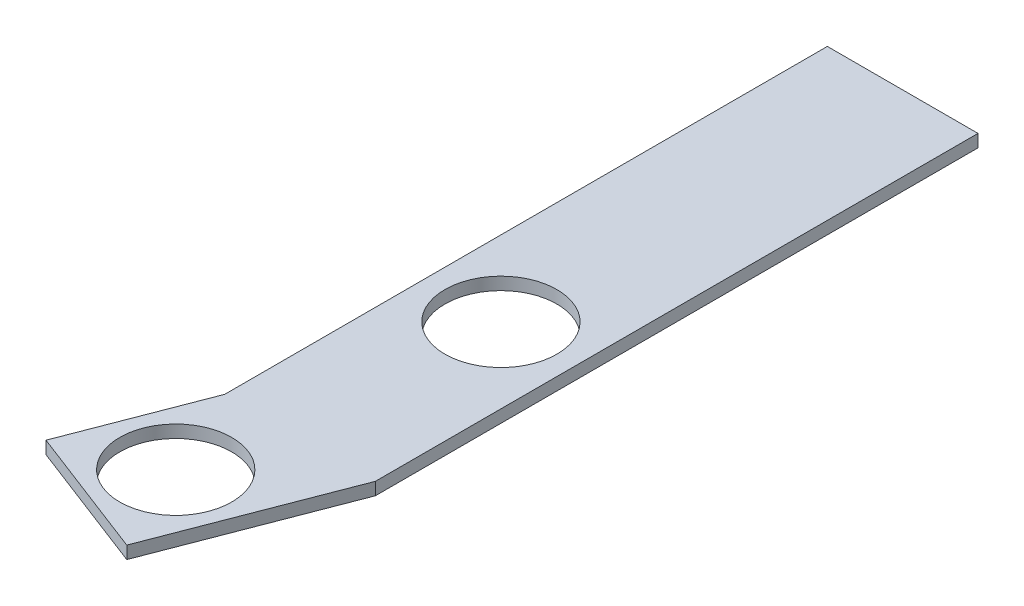
ISO-10303-21;
HEADER;
FILE_DESCRIPTION(('STEP AP214'),'2;1');
FILE_NAME('part.step','',(''),(''),'','','');
FILE_SCHEMA(('AUTOMOTIVE_DESIGN { 1 0 10303 214 1 1 1 1 }'));
ENDSEC;
DATA;
#1=APPLICATION_CONTEXT('core data for automotive mechanical design processes');
#2=APPLICATION_PROTOCOL_DEFINITION('international standard','automotive_design',2000,#1);
#3=PRODUCT_CONTEXT('',#1,'mechanical');
#4=PRODUCT('Part','Part','',(#3));
#5=PRODUCT_RELATED_PRODUCT_CATEGORY('part','',(#4));
#6=PRODUCT_DEFINITION_FORMATION('','',#4);
#7=PRODUCT_DEFINITION_CONTEXT('part definition',#1,'design');
#8=PRODUCT_DEFINITION('design','',#6,#7);
#9=PRODUCT_DEFINITION_SHAPE('','',#8);
#10=(LENGTH_UNIT() NAMED_UNIT(*) SI_UNIT(.MILLI.,.METRE.));
#11=(NAMED_UNIT(*) PLANE_ANGLE_UNIT() SI_UNIT($,.RADIAN.));
#12=(NAMED_UNIT(*) SI_UNIT($,.STERADIAN.) SOLID_ANGLE_UNIT());
#13=UNCERTAINTY_MEASURE_WITH_UNIT(LENGTH_MEASURE(1.E-05),#10,'distance_accuracy_value','');
#14=(GEOMETRIC_REPRESENTATION_CONTEXT(3) GLOBAL_UNCERTAINTY_ASSIGNED_CONTEXT((#13)) GLOBAL_UNIT_ASSIGNED_CONTEXT((#10,
#11,#12)) REPRESENTATION_CONTEXT('',''));
#15=CARTESIAN_POINT('',(0.,0.,0.));
#16=DIRECTION('',(0.,0.,1.));
#17=DIRECTION('',(1.,0.,0.));
#18=AXIS2_PLACEMENT_3D('',#15,#16,#17);
#19=CARTESIAN_POINT('',(1.58405379506825,3.175,121.606827019498));
#20=DIRECTION('',(-0.933333333333333,0.,-0.359010987142301));
#21=DIRECTION('',(-0.359010987142301,0.,0.933333333333333));
#22=AXIS2_PLACEMENT_3D('',#19,#20,#21);
#23=PLANE('',#22);
#24=DIRECTION('',(0.359010987142301,0.,-0.933333333333333));
#25=VECTOR('',#24,1.);
#26=CARTESIAN_POINT('',(1.58405379506825,0.,121.606827019498));
#27=LINE('',#26,#25);
#28=CARTESIAN_POINT('',(1.58405379506825,0.,121.606827019498));
#29=VERTEX_POINT('',#28);
#30=CARTESIAN_POINT('',(19.05,0.,76.2));
#31=VERTEX_POINT('',#30);
#32=EDGE_CURVE('E127',#29,#31,#27,.T.);
#33=ORIENTED_EDGE('',*,*,#32,.T.);
#34=DIRECTION('',(0.,-1.,0.));
#35=VECTOR('',#34,1.);
#36=CARTESIAN_POINT('',(19.05,3.175,76.2));
#37=LINE('',#36,#35);
#38=CARTESIAN_POINT('',(19.05,3.175,76.2));
#39=VERTEX_POINT('',#38);
#40=EDGE_CURVE('E11',#39,#31,#37,.T.);
#41=ORIENTED_EDGE('',*,*,#40,.F.);
#42=DIRECTION('',(0.359010987142301,0.,-0.933333333333333));
#43=VECTOR('',#42,1.);
#44=CARTESIAN_POINT('',(1.58405379506825,3.175,121.606827019498));
#45=LINE('',#44,#43);
#46=CARTESIAN_POINT('',(1.58405379506825,3.175,121.606827019498));
#47=VERTEX_POINT('',#46);
#48=EDGE_CURVE('E144',#47,#39,#45,.T.);
#49=ORIENTED_EDGE('',*,*,#48,.F.);
#50=DIRECTION('',(0.,-1.,0.));
#51=VECTOR('',#50,1.);
#52=CARTESIAN_POINT('',(1.58405379506825,3.175,121.606827019498));
#53=LINE('',#52,#51);
#54=EDGE_CURVE('E123',#47,#29,#53,.T.);
#55=ORIENTED_EDGE('',*,*,#54,.T.);
#56=EDGE_LOOP('',(#33,#41,#49,#55));
#57=FACE_BOUND('',#56,.T.);
#58=ADVANCED_FACE('F38',(#57),#23,.F.);
#59=CARTESIAN_POINT('',(19.05,3.175,-76.2));
#60=DIRECTION('',(-1.,0.,0.));
#61=DIRECTION('',(0.,0.,1.));
#62=AXIS2_PLACEMENT_3D('',#59,#60,#61);
#63=PLANE('',#62);
#64=DIRECTION('',(0.,0.,-1.));
#65=VECTOR('',#64,1.);
#66=CARTESIAN_POINT('',(19.05,0.,-76.2));
#67=LINE('',#66,#65);
#68=CARTESIAN_POINT('',(19.05,0.,-76.2));
#69=VERTEX_POINT('',#68);
#70=EDGE_CURVE('E131',#31,#69,#67,.T.);
#71=ORIENTED_EDGE('',*,*,#70,.T.);
#72=DIRECTION('',(0.,-1.,0.));
#73=VECTOR('',#72,1.);
#74=CARTESIAN_POINT('',(19.05,3.175,-76.2));
#75=LINE('',#74,#73);
#76=CARTESIAN_POINT('',(19.05,3.175,-76.2));
#77=VERTEX_POINT('',#76);
#78=EDGE_CURVE('E47',#77,#69,#75,.T.);
#79=ORIENTED_EDGE('',*,*,#78,.F.);
#80=DIRECTION('',(0.,0.,-1.));
#81=VECTOR('',#80,1.);
#82=CARTESIAN_POINT('',(19.05,3.175,-76.2));
#83=LINE('',#82,#81);
#84=EDGE_CURVE('E92',#39,#77,#83,.T.);
#85=ORIENTED_EDGE('',*,*,#84,.F.);
#86=ORIENTED_EDGE('',*,*,#40,.T.);
#87=EDGE_LOOP('',(#71,#79,#85,#86));
#88=FACE_BOUND('',#87,.T.);
#89=ADVANCED_FACE('F174',(#88),#63,.F.);
#90=CARTESIAN_POINT('',(-19.05,3.175,-76.2));
#91=DIRECTION('',(0.,0.,1.));
#92=DIRECTION('',(1.,0.,0.));
#93=AXIS2_PLACEMENT_3D('',#90,#91,#92);
#94=PLANE('',#93);
#95=DIRECTION('',(-1.,0.,0.));
#96=VECTOR('',#95,1.);
#97=CARTESIAN_POINT('',(-19.05,0.,-76.2));
#98=LINE('',#97,#96);
#99=CARTESIAN_POINT('',(-19.05,0.,-76.2));
#100=VERTEX_POINT('',#99);
#101=EDGE_CURVE('E135',#69,#100,#98,.T.);
#102=ORIENTED_EDGE('',*,*,#101,.T.);
#103=DIRECTION('',(0.,-1.,0.));
#104=VECTOR('',#103,1.);
#105=CARTESIAN_POINT('',(-19.05,3.175,-76.2));
#106=LINE('',#105,#104);
#107=CARTESIAN_POINT('',(-19.05,3.175,-76.2));
#108=VERTEX_POINT('',#107);
#109=EDGE_CURVE('E116',#108,#100,#106,.T.);
#110=ORIENTED_EDGE('',*,*,#109,.F.);
#111=DIRECTION('',(-1.,0.,0.));
#112=VECTOR('',#111,1.);
#113=CARTESIAN_POINT('',(-19.05,3.175,-76.2));
#114=LINE('',#113,#112);
#115=EDGE_CURVE('E105',#77,#108,#114,.T.);
#116=ORIENTED_EDGE('',*,*,#115,.F.);
#117=ORIENTED_EDGE('',*,*,#78,.T.);
#118=EDGE_LOOP('',(#102,#110,#116,#117));
#119=FACE_BOUND('',#118,.T.);
#120=ADVANCED_FACE('F154',(#119),#94,.F.);
#121=CARTESIAN_POINT('',(-19.05,3.175,-76.2));
#122=DIRECTION('',(1.,0.,0.));
#123=DIRECTION('',(0.,0.,-1.));
#124=AXIS2_PLACEMENT_3D('',#121,#122,#123);
#125=PLANE('',#124);
#126=DIRECTION('',(0.,0.,1.));
#127=VECTOR('',#126,1.);
#128=CARTESIAN_POINT('',(-19.05,0.,-76.2));
#129=LINE('',#128,#127);
#130=CARTESIAN_POINT('',(-19.05,0.,76.2));
#131=VERTEX_POINT('',#130);
#132=EDGE_CURVE('E114',#100,#131,#129,.T.);
#133=ORIENTED_EDGE('',*,*,#132,.T.);
#134=DIRECTION('',(0.,-1.,0.));
#135=VECTOR('',#134,1.);
#136=CARTESIAN_POINT('',(-19.05,3.175,76.2));
#137=LINE('',#136,#135);
#138=CARTESIAN_POINT('',(-19.05,3.175,76.2));
#139=VERTEX_POINT('',#138);
#140=EDGE_CURVE('E111',#139,#131,#137,.T.);
#141=ORIENTED_EDGE('',*,*,#140,.F.);
#142=DIRECTION('',(0.,0.,1.));
#143=VECTOR('',#142,1.);
#144=CARTESIAN_POINT('',(-19.05,3.175,-76.2));
#145=LINE('',#144,#143);
#146=EDGE_CURVE('E99',#108,#139,#145,.T.);
#147=ORIENTED_EDGE('',*,*,#146,.F.);
#148=ORIENTED_EDGE('',*,*,#109,.T.);
#149=EDGE_LOOP('',(#133,#141,#147,#148));
#150=FACE_BOUND('',#149,.T.);
#151=ADVANCED_FACE('F112',(#150),#125,.F.);
#152=CARTESIAN_POINT('',(-19.05,3.175,76.2));
#153=DIRECTION('',(0.933333333333333,0.,0.359010987142301));
#154=DIRECTION('',(0.359010987142301,0.,-0.933333333333333));
#155=AXIS2_PLACEMENT_3D('',#152,#153,#154);
#156=PLANE('',#155);
#157=DIRECTION('',(-0.359010987142301,0.,0.933333333333333));
#158=VECTOR('',#157,1.);
#159=CARTESIAN_POINT('',(-19.05,0.,76.2));
#160=LINE('',#159,#158);
#161=CARTESIAN_POINT('',(-31.6052795382651,0.,108.840396316718));
#162=VERTEX_POINT('',#161);
#163=EDGE_CURVE('E78',#131,#162,#160,.T.);
#164=ORIENTED_EDGE('',*,*,#163,.T.);
#165=DIRECTION('',(0.,-1.,0.));
#166=VECTOR('',#165,1.);
#167=CARTESIAN_POINT('',(-31.6052795382651,3.175,108.840396316718));
#168=LINE('',#167,#166);
#169=CARTESIAN_POINT('',(-31.6052795382651,3.175,108.840396316718));
#170=VERTEX_POINT('',#169);
#171=EDGE_CURVE('E117',#170,#162,#168,.T.);
#172=ORIENTED_EDGE('',*,*,#171,.F.);
#173=DIRECTION('',(-0.359010987142301,0.,0.933333333333333));
#174=VECTOR('',#173,1.);
#175=CARTESIAN_POINT('',(-19.05,3.175,76.2));
#176=LINE('',#175,#174);
#177=EDGE_CURVE('E103',#139,#170,#176,.T.);
#178=ORIENTED_EDGE('',*,*,#177,.F.);
#179=ORIENTED_EDGE('',*,*,#140,.T.);
#180=EDGE_LOOP('',(#164,#172,#178,#179));
#181=FACE_BOUND('',#180,.T.);
#182=ADVANCED_FACE('F119',(#181),#156,.F.);
#183=CARTESIAN_POINT('',(-31.6052795382651,3.175,108.840396316718));
#184=DIRECTION('',(0.359010987142301,0.,-0.933333333333333));
#185=DIRECTION('',(-0.933333333333333,0.,-0.359010987142301));
#186=AXIS2_PLACEMENT_3D('',#183,#184,#185);
#187=PLANE('',#186);
#188=DIRECTION('',(0.933333333333333,0.,0.359010987142301));
#189=VECTOR('',#188,1.);
#190=CARTESIAN_POINT('',(-31.6052795382651,0.,108.840396316718));
#191=LINE('',#190,#189);
#192=EDGE_CURVE('E84',#162,#29,#191,.T.);
#193=ORIENTED_EDGE('',*,*,#192,.T.);
#194=ORIENTED_EDGE('',*,*,#54,.F.);
#195=DIRECTION('',(0.933333333333333,0.,0.359010987142301));
#196=VECTOR('',#195,1.);
#197=CARTESIAN_POINT('',(-31.6052795382651,3.175,108.840396316718));
#198=LINE('',#197,#196);
#199=EDGE_CURVE('E55',#170,#47,#198,.T.);
#200=ORIENTED_EDGE('',*,*,#199,.F.);
#201=ORIENTED_EDGE('',*,*,#171,.T.);
#202=EDGE_LOOP('',(#193,#194,#200,#201));
#203=FACE_BOUND('',#202,.T.);
#204=ADVANCED_FACE('F161',(#203),#187,.F.);
#205=CARTESIAN_POINT('',(0.,3.175,0.));
#206=DIRECTION('',(0.,-1.,0.));
#207=DIRECTION('',(0.,0.,-1.));
#208=AXIS2_PLACEMENT_3D('',#205,#206,#207);
#209=PLANE('',#208);
#210=CARTESIAN_POINT('',(0.,3.175,25.4));
#211=DIRECTION('',(0.,1.,0.));
#212=DIRECTION('',(0.,0.,1.));
#213=AXIS2_PLACEMENT_3D('',#210,#211,#212);
#214=CIRCLE('',#213,14.1605);
#215=CARTESIAN_POINT('',(0.,3.175,39.5605));
#216=VERTEX_POINT('',#215);
#217=EDGE_CURVE('E235',#216,#216,#214,.T.);
#218=ORIENTED_EDGE('',*,*,#217,.F.);
#219=EDGE_LOOP('',(#218));
#220=FACE_BOUND('',#219,.T.);
#221=CARTESIAN_POINT('',(-8.73297310246588,3.175,98.9034135097489));
#222=DIRECTION('',(0.,1.,0.));
#223=DIRECTION('',(0.,0.,1.));
#224=AXIS2_PLACEMENT_3D('',#221,#222,#223);
#225=CIRCLE('',#224,14.1605);
#226=CARTESIAN_POINT('',(-8.73297310246588,3.175,113.063913509749));
#227=VERTEX_POINT('',#226);
#228=EDGE_CURVE('E239',#227,#227,#225,.T.);
#229=ORIENTED_EDGE('',*,*,#228,.F.);
#230=EDGE_LOOP('',(#229));
#231=FACE_BOUND('',#230,.T.);
#232=ORIENTED_EDGE('',*,*,#48,.T.);
#233=ORIENTED_EDGE('',*,*,#84,.T.);
#234=ORIENTED_EDGE('',*,*,#115,.T.);
#235=ORIENTED_EDGE('',*,*,#146,.T.);
#236=ORIENTED_EDGE('',*,*,#177,.T.);
#237=ORIENTED_EDGE('',*,*,#199,.T.);
#238=EDGE_LOOP('',(#232,#233,#234,#235,#236,#237));
#239=FACE_BOUND('',#238,.T.);
#240=ADVANCED_FACE('F101',(#220,#231,#239),#209,.F.);
#241=CARTESIAN_POINT('',(0.,0.,0.));
#242=DIRECTION('',(0.,-1.,0.));
#243=DIRECTION('',(0.,0.,-1.));
#244=AXIS2_PLACEMENT_3D('',#241,#242,#243);
#245=PLANE('',#244);
#246=CARTESIAN_POINT('',(0.,0.,25.4));
#247=DIRECTION('',(0.,1.,0.));
#248=DIRECTION('',(0.,0.,1.));
#249=AXIS2_PLACEMENT_3D('',#246,#247,#248);
#250=CIRCLE('',#249,14.1605);
#251=CARTESIAN_POINT('',(0.,0.,39.5605));
#252=VERTEX_POINT('',#251);
#253=EDGE_CURVE('E232',#252,#252,#250,.T.);
#254=ORIENTED_EDGE('',*,*,#253,.T.);
#255=EDGE_LOOP('',(#254));
#256=FACE_BOUND('',#255,.T.);
#257=CARTESIAN_POINT('',(-8.73297310246588,0.,98.9034135097489));
#258=DIRECTION('',(0.,1.,0.));
#259=DIRECTION('',(0.,0.,1.));
#260=AXIS2_PLACEMENT_3D('',#257,#258,#259);
#261=CIRCLE('',#260,14.1605);
#262=CARTESIAN_POINT('',(-8.73297310246588,0.,113.063913509749));
#263=VERTEX_POINT('',#262);
#264=EDGE_CURVE('E132',#263,#263,#261,.T.);
#265=ORIENTED_EDGE('',*,*,#264,.T.);
#266=EDGE_LOOP('',(#265));
#267=FACE_BOUND('',#266,.T.);
#268=ORIENTED_EDGE('',*,*,#32,.F.);
#269=ORIENTED_EDGE('',*,*,#192,.F.);
#270=ORIENTED_EDGE('',*,*,#163,.F.);
#271=ORIENTED_EDGE('',*,*,#132,.F.);
#272=ORIENTED_EDGE('',*,*,#101,.F.);
#273=ORIENTED_EDGE('',*,*,#70,.F.);
#274=EDGE_LOOP('',(#268,#269,#270,#271,#272,#273));
#275=FACE_BOUND('',#274,.T.);
#276=ADVANCED_FACE('F157',(#256,#267,#275),#245,.T.);
#277=CARTESIAN_POINT('',(-8.73297310246588,0.,98.9034135097489));
#278=DIRECTION('',(0.,1.,0.));
#279=DIRECTION('',(0.,0.,1.));
#280=AXIS2_PLACEMENT_3D('',#277,#278,#279);
#281=CYLINDRICAL_SURFACE('',#280,14.1605);
#282=ORIENTED_EDGE('',*,*,#264,.F.);
#283=EDGE_LOOP('',(#282));
#284=FACE_BOUND('',#283,.T.);
#285=ORIENTED_EDGE('',*,*,#228,.T.);
#286=EDGE_LOOP('',(#285));
#287=FACE_BOUND('',#286,.T.);
#288=ADVANCED_FACE('F202',(#284,#287),#281,.F.);
#289=CARTESIAN_POINT('',(0.,0.,25.4));
#290=DIRECTION('',(0.,1.,0.));
#291=DIRECTION('',(0.,0.,1.));
#292=AXIS2_PLACEMENT_3D('',#289,#290,#291);
#293=CYLINDRICAL_SURFACE('',#292,14.1605);
#294=ORIENTED_EDGE('',*,*,#253,.F.);
#295=EDGE_LOOP('',(#294));
#296=FACE_BOUND('',#295,.T.);
#297=ORIENTED_EDGE('',*,*,#217,.T.);
#298=EDGE_LOOP('',(#297));
#299=FACE_BOUND('',#298,.T.);
#300=ADVANCED_FACE('F206',(#296,#299),#293,.F.);
#301=CLOSED_SHELL('',(#58,#89,#120,#151,#182,#204,#240,#276,#288,#300));
#302=MANIFOLD_SOLID_BREP('B2',#301);
#303=ADVANCED_BREP_SHAPE_REPRESENTATION('',(#18,#302),#14);
#304=SHAPE_DEFINITION_REPRESENTATION(#9,#303);
ENDSEC;
END-ISO-10303-21;
